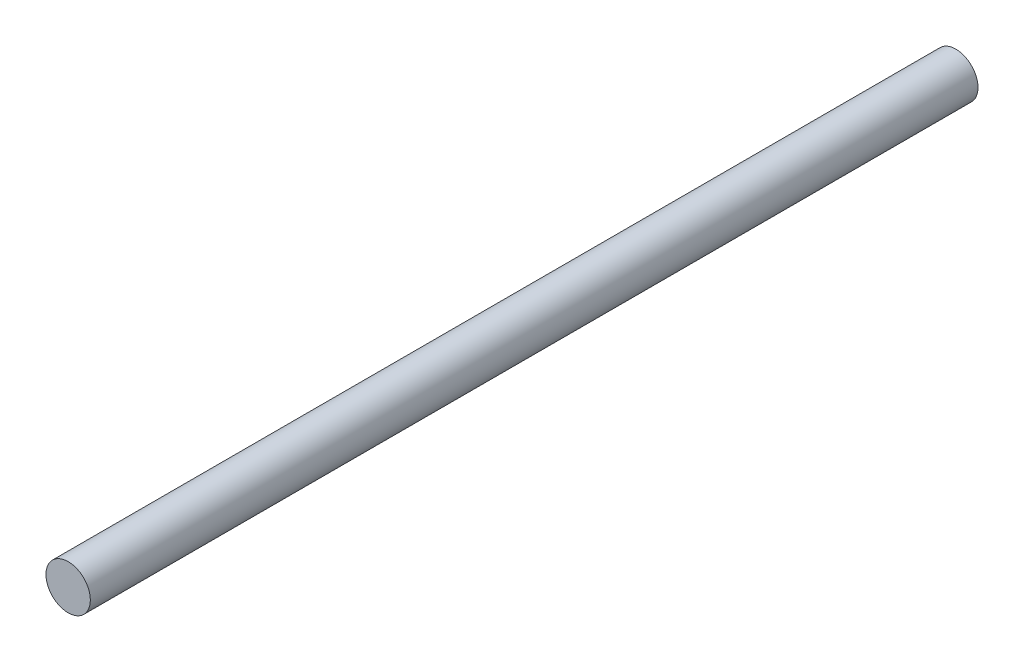
ISO-10303-21;
HEADER;
FILE_DESCRIPTION(('STEP AP214'),'2;1');
FILE_NAME('part.step','',(''),(''),'','','');
FILE_SCHEMA(('AUTOMOTIVE_DESIGN { 1 0 10303 214 1 1 1 1 }'));
ENDSEC;
DATA;
#1=APPLICATION_CONTEXT('core data for automotive mechanical design processes');
#2=APPLICATION_PROTOCOL_DEFINITION('international standard','automotive_design',2000,#1);
#3=PRODUCT_CONTEXT('',#1,'mechanical');
#4=PRODUCT('Part','Part','',(#3));
#5=PRODUCT_RELATED_PRODUCT_CATEGORY('part','',(#4));
#6=PRODUCT_DEFINITION_FORMATION('','',#4);
#7=PRODUCT_DEFINITION_CONTEXT('part definition',#1,'design');
#8=PRODUCT_DEFINITION('design','',#6,#7);
#9=PRODUCT_DEFINITION_SHAPE('','',#8);
#10=(LENGTH_UNIT() NAMED_UNIT(*) SI_UNIT(.MILLI.,.METRE.));
#11=(NAMED_UNIT(*) PLANE_ANGLE_UNIT() SI_UNIT($,.RADIAN.));
#12=(NAMED_UNIT(*) SI_UNIT($,.STERADIAN.) SOLID_ANGLE_UNIT());
#13=UNCERTAINTY_MEASURE_WITH_UNIT(LENGTH_MEASURE(1.E-05),#10,'distance_accuracy_value','');
#14=(GEOMETRIC_REPRESENTATION_CONTEXT(3) GLOBAL_UNCERTAINTY_ASSIGNED_CONTEXT((#13)) GLOBAL_UNIT_ASSIGNED_CONTEXT((#10,
#11,#12)) REPRESENTATION_CONTEXT('',''));
#15=CARTESIAN_POINT('',(0.,0.,0.));
#16=DIRECTION('',(0.,0.,1.));
#17=DIRECTION('',(1.,0.,0.));
#18=AXIS2_PLACEMENT_3D('',#15,#16,#17);
#19=CARTESIAN_POINT('',(0.,0.,100.));
#20=DIRECTION('',(0.,0.,-1.));
#21=DIRECTION('',(-1.,0.,0.));
#22=AXIS2_PLACEMENT_3D('',#19,#20,#21);
#23=CYLINDRICAL_SURFACE('',#22,2.5);
#24=CARTESIAN_POINT('',(0.,0.,100.));
#25=DIRECTION('',(0.,0.,1.));
#26=DIRECTION('',(1.,0.,0.));
#27=AXIS2_PLACEMENT_3D('',#24,#25,#26);
#28=CIRCLE('',#27,2.5);
#29=CARTESIAN_POINT('',(2.5,0.,100.));
#30=VERTEX_POINT('',#29);
#31=EDGE_CURVE('E10',#30,#30,#28,.T.);
#32=ORIENTED_EDGE('',*,*,#31,.F.);
#33=EDGE_LOOP('',(#32));
#34=FACE_BOUND('',#33,.T.);
#35=CARTESIAN_POINT('',(0.,0.,0.));
#36=DIRECTION('',(0.,0.,1.));
#37=DIRECTION('',(1.,0.,0.));
#38=AXIS2_PLACEMENT_3D('',#35,#36,#37);
#39=CIRCLE('',#38,2.5);
#40=CARTESIAN_POINT('',(2.5,0.,0.));
#41=VERTEX_POINT('',#40);
#42=EDGE_CURVE('E40',#41,#41,#39,.T.);
#43=ORIENTED_EDGE('',*,*,#42,.T.);
#44=EDGE_LOOP('',(#43));
#45=FACE_BOUND('',#44,.T.);
#46=ADVANCED_FACE('F37',(#34,#45),#23,.T.);
#47=CARTESIAN_POINT('',(0.,0.,100.));
#48=DIRECTION('',(0.,0.,1.));
#49=DIRECTION('',(1.,0.,0.));
#50=AXIS2_PLACEMENT_3D('',#47,#48,#49);
#51=PLANE('',#50);
#52=ORIENTED_EDGE('',*,*,#31,.T.);
#53=EDGE_LOOP('',(#52));
#54=FACE_BOUND('',#53,.T.);
#55=ADVANCED_FACE('F52',(#54),#51,.T.);
#56=CARTESIAN_POINT('',(0.,0.,0.));
#57=DIRECTION('',(0.,0.,1.));
#58=DIRECTION('',(1.,0.,0.));
#59=AXIS2_PLACEMENT_3D('',#56,#57,#58);
#60=PLANE('',#59);
#61=ORIENTED_EDGE('',*,*,#42,.F.);
#62=EDGE_LOOP('',(#61));
#63=FACE_BOUND('',#62,.T.);
#64=ADVANCED_FACE('F50',(#63),#60,.F.);
#65=CLOSED_SHELL('',(#46,#55,#64));
#66=MANIFOLD_SOLID_BREP('B2',#65);
#67=ADVANCED_BREP_SHAPE_REPRESENTATION('',(#18,#66),#14);
#68=SHAPE_DEFINITION_REPRESENTATION(#9,#67);
ENDSEC;
END-ISO-10303-21;
